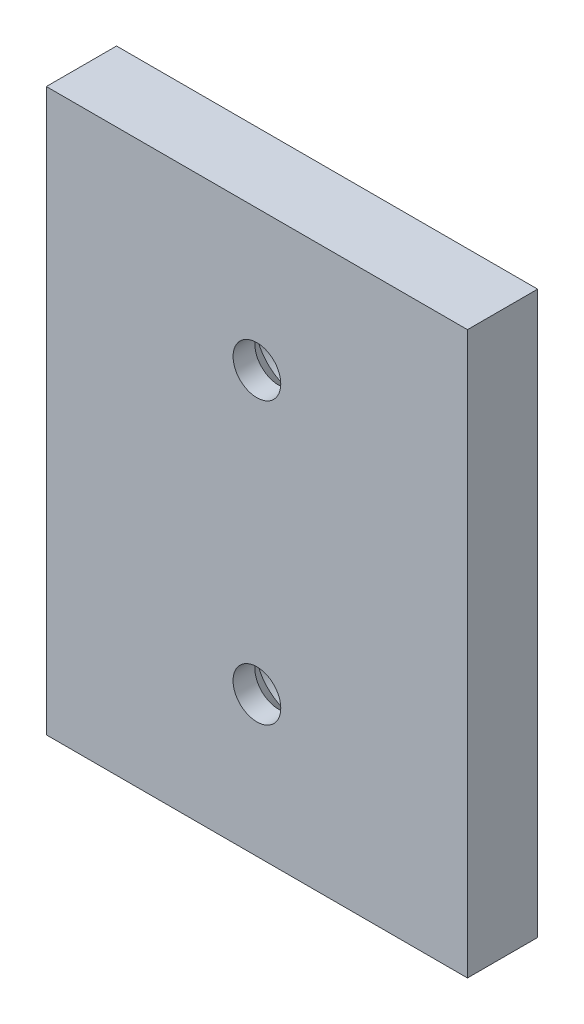
ISO-10303-21;
HEADER;
FILE_DESCRIPTION(('STEP AP214'),'2;1');
FILE_NAME('part.step','',(''),(''),'','','');
FILE_SCHEMA(('AUTOMOTIVE_DESIGN { 1 0 10303 214 1 1 1 1 }'));
ENDSEC;
DATA;
#1=APPLICATION_CONTEXT('core data for automotive mechanical design processes');
#2=APPLICATION_PROTOCOL_DEFINITION('international standard','automotive_design',2000,#1);
#3=PRODUCT_CONTEXT('',#1,'mechanical');
#4=PRODUCT('Part','Part','',(#3));
#5=PRODUCT_RELATED_PRODUCT_CATEGORY('part','',(#4));
#6=PRODUCT_DEFINITION_FORMATION('','',#4);
#7=PRODUCT_DEFINITION_CONTEXT('part definition',#1,'design');
#8=PRODUCT_DEFINITION('design','',#6,#7);
#9=PRODUCT_DEFINITION_SHAPE('','',#8);
#10=(LENGTH_UNIT() NAMED_UNIT(*) SI_UNIT(.MILLI.,.METRE.));
#11=(NAMED_UNIT(*) PLANE_ANGLE_UNIT() SI_UNIT($,.RADIAN.));
#12=(NAMED_UNIT(*) SI_UNIT($,.STERADIAN.) SOLID_ANGLE_UNIT());
#13=UNCERTAINTY_MEASURE_WITH_UNIT(LENGTH_MEASURE(1.E-05),#10,'distance_accuracy_value','');
#14=(GEOMETRIC_REPRESENTATION_CONTEXT(3) GLOBAL_UNCERTAINTY_ASSIGNED_CONTEXT((#13)) GLOBAL_UNIT_ASSIGNED_CONTEXT((#10,
#11,#12)) REPRESENTATION_CONTEXT('',''));
#15=CARTESIAN_POINT('',(0.,0.,0.));
#16=DIRECTION('',(0.,0.,1.));
#17=DIRECTION('',(1.,0.,0.));
#18=AXIS2_PLACEMENT_3D('',#15,#16,#17);
#19=CARTESIAN_POINT('',(15.,10.,0.002300000000105));
#20=DIRECTION('',(0.,0.,1.));
#21=DIRECTION('',(1.,0.,0.));
#22=AXIS2_PLACEMENT_3D('',#19,#20,#21);
#23=CYLINDRICAL_SURFACE('',#22,3.25);
#24=CARTESIAN_POINT('',(15.,10.,0.002299999999991));
#25=DIRECTION('',(0.,0.,1.));
#26=DIRECTION('',(1.,0.,0.));
#27=AXIS2_PLACEMENT_3D('',#24,#25,#26);
#28=CIRCLE('',#27,3.25);
#29=CARTESIAN_POINT('',(18.25,10.,0.002299999999991));
#30=VERTEX_POINT('',#29);
#31=EDGE_CURVE('E94',#30,#30,#28,.F.);
#32=ORIENTED_EDGE('',*,*,#31,.T.);
#33=EDGE_LOOP('',(#32));
#34=FACE_BOUND('',#33,.T.);
#35=CARTESIAN_POINT('',(15.,10.,2.0023));
#36=DIRECTION('',(0.,0.,1.));
#37=DIRECTION('',(1.,0.,0.));
#38=AXIS2_PLACEMENT_3D('',#35,#36,#37);
#39=CIRCLE('',#38,3.25);
#40=CARTESIAN_POINT('',(18.25,10.,2.0023));
#41=VERTEX_POINT('',#40);
#42=EDGE_CURVE('E19',#41,#41,#39,.T.);
#43=ORIENTED_EDGE('',*,*,#42,.T.);
#44=EDGE_LOOP('',(#43));
#45=FACE_BOUND('',#44,.T.);
#46=ADVANCED_FACE('F16',(#34,#45),#23,.F.);
#47=CARTESIAN_POINT('',(15.,30.,0.002300000000105));
#48=DIRECTION('',(0.,0.,1.));
#49=DIRECTION('',(1.,0.,0.));
#50=AXIS2_PLACEMENT_3D('',#47,#48,#49);
#51=CYLINDRICAL_SURFACE('',#50,3.25);
#52=CARTESIAN_POINT('',(15.,30.,0.002299999999991));
#53=DIRECTION('',(0.,0.,1.));
#54=DIRECTION('',(1.,0.,0.));
#55=AXIS2_PLACEMENT_3D('',#52,#53,#54);
#56=CIRCLE('',#55,3.25);
#57=CARTESIAN_POINT('',(18.25,30.,0.002299999999991));
#58=VERTEX_POINT('',#57);
#59=EDGE_CURVE('E91',#58,#58,#56,.F.);
#60=ORIENTED_EDGE('',*,*,#59,.T.);
#61=EDGE_LOOP('',(#60));
#62=FACE_BOUND('',#61,.T.);
#63=CARTESIAN_POINT('',(15.,30.,2.0023));
#64=DIRECTION('',(0.,0.,1.));
#65=DIRECTION('',(1.,0.,0.));
#66=AXIS2_PLACEMENT_3D('',#63,#64,#65);
#67=CIRCLE('',#66,3.25);
#68=CARTESIAN_POINT('',(18.25,30.,2.0023));
#69=VERTEX_POINT('',#68);
#70=EDGE_CURVE('E96',#69,#69,#67,.T.);
#71=ORIENTED_EDGE('',*,*,#70,.T.);
#72=EDGE_LOOP('',(#71));
#73=FACE_BOUND('',#72,.T.);
#74=ADVANCED_FACE('F107',(#62,#73),#51,.F.);
#75=CARTESIAN_POINT('',(15.,10.,2.0023));
#76=DIRECTION('',(0.,0.,1.));
#77=DIRECTION('',(1.,0.,0.));
#78=AXIS2_PLACEMENT_3D('',#75,#76,#77);
#79=PLANE('',#78);
#80=CARTESIAN_POINT('',(15.,10.,2.00229999995827));
#81=DIRECTION('',(0.,0.,-1.));
#82=DIRECTION('',(-1.,0.,0.));
#83=AXIS2_PLACEMENT_3D('',#80,#81,#82);
#84=CIRCLE('',#83,3.15000000004829);
#85=CARTESIAN_POINT('',(11.8499999999517,10.,2.00229999995827));
#86=VERTEX_POINT('',#85);
#87=EDGE_CURVE('E88',#86,#86,#84,.F.);
#88=ORIENTED_EDGE('',*,*,#87,.T.);
#89=EDGE_LOOP('',(#88));
#90=FACE_BOUND('',#89,.T.);
#91=ORIENTED_EDGE('',*,*,#42,.F.);
#92=EDGE_LOOP('',(#91));
#93=FACE_BOUND('',#92,.T.);
#94=ADVANCED_FACE('F104',(#90,#93),#79,.F.);
#95=CARTESIAN_POINT('',(15.,30.,2.0023));
#96=DIRECTION('',(0.,0.,1.));
#97=DIRECTION('',(1.,0.,0.));
#98=AXIS2_PLACEMENT_3D('',#95,#96,#97);
#99=PLANE('',#98);
#100=CARTESIAN_POINT('',(15.,30.,2.00229999995827));
#101=DIRECTION('',(0.,0.,-1.));
#102=DIRECTION('',(-1.,0.,0.));
#103=AXIS2_PLACEMENT_3D('',#100,#101,#102);
#104=CIRCLE('',#103,3.15000000004829);
#105=CARTESIAN_POINT('',(11.8499999999517,30.,2.00229999995827));
#106=VERTEX_POINT('',#105);
#107=EDGE_CURVE('E72',#106,#106,#104,.F.);
#108=ORIENTED_EDGE('',*,*,#107,.T.);
#109=EDGE_LOOP('',(#108));
#110=FACE_BOUND('',#109,.T.);
#111=ORIENTED_EDGE('',*,*,#70,.F.);
#112=EDGE_LOOP('',(#111));
#113=FACE_BOUND('',#112,.T.);
#114=ADVANCED_FACE('F106',(#110,#113),#99,.F.);
#115=CARTESIAN_POINT('',(0.,0.,0.002300000000105));
#116=DIRECTION('',(0.,0.,1.));
#117=DIRECTION('',(1.,0.,0.));
#118=AXIS2_PLACEMENT_3D('',#115,#116,#117);
#119=PLANE('',#118);
#120=ORIENTED_EDGE('',*,*,#59,.F.);
#121=EDGE_LOOP('',(#120));
#122=FACE_BOUND('',#121,.T.);
#123=ORIENTED_EDGE('',*,*,#31,.F.);
#124=EDGE_LOOP('',(#123));
#125=FACE_BOUND('',#124,.T.);
#126=DIRECTION('',(0.,1.,0.));
#127=VECTOR('',#126,1.);
#128=CARTESIAN_POINT('',(30.,0.,0.002299999999991));
#129=LINE('',#128,#127);
#130=CARTESIAN_POINT('',(30.,0.,0.0023000000000195));
#131=VERTEX_POINT('',#130);
#132=CARTESIAN_POINT('',(30.,40.,0.002300000000048));
#133=VERTEX_POINT('',#132);
#134=EDGE_CURVE('E62',#131,#133,#129,.T.);
#135=ORIENTED_EDGE('',*,*,#134,.F.);
#136=DIRECTION('',(1.,0.,0.));
#137=VECTOR('',#136,1.);
#138=CARTESIAN_POINT('',(0.,0.,0.002299999999991));
#139=LINE('',#138,#137);
#140=CARTESIAN_POINT('',(0.,0.,0.002300000000048));
#141=VERTEX_POINT('',#140);
#142=EDGE_CURVE('E55',#131,#141,#139,.F.);
#143=ORIENTED_EDGE('',*,*,#142,.T.);
#144=DIRECTION('',(0.,1.,0.));
#145=VECTOR('',#144,1.);
#146=CARTESIAN_POINT('',(0.,0.,0.002299999999991));
#147=LINE('',#146,#145);
#148=CARTESIAN_POINT('',(0.,40.,0.002300000000048));
#149=VERTEX_POINT('',#148);
#150=EDGE_CURVE('E60',#141,#149,#147,.T.);
#151=ORIENTED_EDGE('',*,*,#150,.T.);
#152=DIRECTION('',(1.,0.,0.));
#153=VECTOR('',#152,1.);
#154=CARTESIAN_POINT('',(0.,40.,0.002299999999991));
#155=LINE('',#154,#153);
#156=EDGE_CURVE('E262',#133,#149,#155,.F.);
#157=ORIENTED_EDGE('',*,*,#156,.F.);
#158=EDGE_LOOP('',(#135,#143,#151,#157));
#159=FACE_BOUND('',#158,.T.);
#160=ADVANCED_FACE('F59',(#122,#125,#159),#119,.F.);
#161=CARTESIAN_POINT('',(15.,10.,2.00229999990142));
#162=DIRECTION('',(0.,0.,-1.));
#163=DIRECTION('',(-1.,0.,0.));
#164=AXIS2_PLACEMENT_3D('',#161,#162,#163);
#165=CONICAL_SURFACE('',#164,3.15000000010514,0.785398163377847);
#166=ORIENTED_EDGE('',*,*,#87,.F.);
#167=EDGE_LOOP('',(#166));
#168=FACE_BOUND('',#167,.T.);
#169=CARTESIAN_POINT('',(15.,10.,3.4523));
#170=DIRECTION('',(0.,0.,1.));
#171=DIRECTION('',(1.,0.,0.));
#172=AXIS2_PLACEMENT_3D('',#169,#170,#171);
#173=CIRCLE('',#172,1.7);
#174=CARTESIAN_POINT('',(16.7,10.,3.4523));
#175=VERTEX_POINT('',#174);
#176=EDGE_CURVE('E251',#175,#175,#173,.T.);
#177=ORIENTED_EDGE('',*,*,#176,.T.);
#178=EDGE_LOOP('',(#177));
#179=FACE_BOUND('',#178,.T.);
#180=ADVANCED_FACE('F148',(#168,#179),#165,.F.);
#181=CARTESIAN_POINT('',(15.,30.,2.00229999990142));
#182=DIRECTION('',(0.,0.,-1.));
#183=DIRECTION('',(-1.,0.,0.));
#184=AXIS2_PLACEMENT_3D('',#181,#182,#183);
#185=CONICAL_SURFACE('',#184,3.15000000010514,0.785398163377847);
#186=ORIENTED_EDGE('',*,*,#107,.F.);
#187=EDGE_LOOP('',(#186));
#188=FACE_BOUND('',#187,.T.);
#189=CARTESIAN_POINT('',(15.,30.,3.4523));
#190=DIRECTION('',(0.,0.,1.));
#191=DIRECTION('',(1.,0.,0.));
#192=AXIS2_PLACEMENT_3D('',#189,#190,#191);
#193=CIRCLE('',#192,1.7);
#194=CARTESIAN_POINT('',(16.7,30.,3.4523));
#195=VERTEX_POINT('',#194);
#196=EDGE_CURVE('E253',#195,#195,#193,.T.);
#197=ORIENTED_EDGE('',*,*,#196,.T.);
#198=EDGE_LOOP('',(#197));
#199=FACE_BOUND('',#198,.T.);
#200=ADVANCED_FACE('F145',(#188,#199),#185,.F.);
#201=CARTESIAN_POINT('',(0.,0.,0.002300000000105));
#202=DIRECTION('',(1.,0.,0.));
#203=DIRECTION('',(0.,0.,-1.));
#204=AXIS2_PLACEMENT_3D('',#201,#202,#203);
#205=PLANE('',#204);
#206=DIRECTION('',(0.,0.,1.));
#207=VECTOR('',#206,1.);
#208=CARTESIAN_POINT('',(0.,40.,0.002300000000105));
#209=LINE('',#208,#207);
#210=CARTESIAN_POINT('',(0.,40.,5.0023));
#211=VERTEX_POINT('',#210);
#212=EDGE_CURVE('E70',#149,#211,#209,.T.);
#213=ORIENTED_EDGE('',*,*,#212,.F.);
#214=ORIENTED_EDGE('',*,*,#150,.F.);
#215=DIRECTION('',(0.,0.,1.));
#216=VECTOR('',#215,1.);
#217=CARTESIAN_POINT('',(0.,0.,0.002300000000105));
#218=LINE('',#217,#216);
#219=CARTESIAN_POINT('',(0.,0.,5.0023));
#220=VERTEX_POINT('',#219);
#221=EDGE_CURVE('E64',#141,#220,#218,.T.);
#222=ORIENTED_EDGE('',*,*,#221,.T.);
#223=DIRECTION('',(0.,1.,0.));
#224=VECTOR('',#223,1.);
#225=CARTESIAN_POINT('',(0.,0.,5.0023));
#226=LINE('',#225,#224);
#227=EDGE_CURVE('E256',#211,#220,#226,.F.);
#228=ORIENTED_EDGE('',*,*,#227,.F.);
#229=EDGE_LOOP('',(#213,#214,#222,#228));
#230=FACE_BOUND('',#229,.T.);
#231=ADVANCED_FACE('F67',(#230),#205,.F.);
#232=CARTESIAN_POINT('',(0.,0.,0.002300000000105));
#233=DIRECTION('',(0.,1.,0.));
#234=DIRECTION('',(0.,0.,1.));
#235=AXIS2_PLACEMENT_3D('',#232,#233,#234);
#236=PLANE('',#235);
#237=DIRECTION('',(1.,0.,0.));
#238=VECTOR('',#237,1.);
#239=CARTESIAN_POINT('',(0.,0.,5.0023));
#240=LINE('',#239,#238);
#241=CARTESIAN_POINT('',(30.,0.,5.0023));
#242=VERTEX_POINT('',#241);
#243=EDGE_CURVE('E76',#220,#242,#240,.T.);
#244=ORIENTED_EDGE('',*,*,#243,.F.);
#245=ORIENTED_EDGE('',*,*,#221,.F.);
#246=ORIENTED_EDGE('',*,*,#142,.F.);
#247=DIRECTION('',(0.,0.,-1.));
#248=VECTOR('',#247,1.);
#249=CARTESIAN_POINT('',(30.,0.,0.002300000000105));
#250=LINE('',#249,#248);
#251=EDGE_CURVE('E78',#242,#131,#250,.T.);
#252=ORIENTED_EDGE('',*,*,#251,.F.);
#253=EDGE_LOOP('',(#244,#245,#246,#252));
#254=FACE_BOUND('',#253,.T.);
#255=ADVANCED_FACE('F74',(#254),#236,.F.);
#256=CARTESIAN_POINT('',(30.,0.,0.002300000000105));
#257=DIRECTION('',(1.,0.,0.));
#258=DIRECTION('',(0.,0.,-1.));
#259=AXIS2_PLACEMENT_3D('',#256,#257,#258);
#260=PLANE('',#259);
#261=DIRECTION('',(0.,0.,1.));
#262=VECTOR('',#261,1.);
#263=CARTESIAN_POINT('',(30.,40.,0.002300000000105));
#264=LINE('',#263,#262);
#265=CARTESIAN_POINT('',(30.,40.,5.0023));
#266=VERTEX_POINT('',#265);
#267=EDGE_CURVE('E34',#266,#133,#264,.F.);
#268=ORIENTED_EDGE('',*,*,#267,.F.);
#269=DIRECTION('',(0.,1.,0.));
#270=VECTOR('',#269,1.);
#271=CARTESIAN_POINT('',(30.,0.,5.0023));
#272=LINE('',#271,#270);
#273=EDGE_CURVE('E266',#242,#266,#272,.T.);
#274=ORIENTED_EDGE('',*,*,#273,.F.);
#275=ORIENTED_EDGE('',*,*,#251,.T.);
#276=ORIENTED_EDGE('',*,*,#134,.T.);
#277=EDGE_LOOP('',(#268,#274,#275,#276));
#278=FACE_BOUND('',#277,.T.);
#279=ADVANCED_FACE('F137',(#278),#260,.T.);
#280=CARTESIAN_POINT('',(0.,40.,0.002300000000105));
#281=DIRECTION('',(0.,1.,0.));
#282=DIRECTION('',(0.,0.,1.));
#283=AXIS2_PLACEMENT_3D('',#280,#281,#282);
#284=PLANE('',#283);
#285=DIRECTION('',(1.,0.,0.));
#286=VECTOR('',#285,1.);
#287=CARTESIAN_POINT('',(0.,40.,5.0023));
#288=LINE('',#287,#286);
#289=EDGE_CURVE('E85',#266,#211,#288,.F.);
#290=ORIENTED_EDGE('',*,*,#289,.F.);
#291=ORIENTED_EDGE('',*,*,#267,.T.);
#292=ORIENTED_EDGE('',*,*,#156,.T.);
#293=ORIENTED_EDGE('',*,*,#212,.T.);
#294=EDGE_LOOP('',(#290,#291,#292,#293));
#295=FACE_BOUND('',#294,.T.);
#296=ADVANCED_FACE('F133',(#295),#284,.T.);
#297=CARTESIAN_POINT('',(15.,10.,0.002300000000105));
#298=DIRECTION('',(0.,0.,1.));
#299=DIRECTION('',(1.,0.,0.));
#300=AXIS2_PLACEMENT_3D('',#297,#298,#299);
#301=CYLINDRICAL_SURFACE('',#300,1.7);
#302=CARTESIAN_POINT('',(15.,10.,5.0023));
#303=DIRECTION('',(0.,0.,1.));
#304=DIRECTION('',(1.,0.,0.));
#305=AXIS2_PLACEMENT_3D('',#302,#303,#304);
#306=CIRCLE('',#305,1.7);
#307=CARTESIAN_POINT('',(16.7,10.,5.0023));
#308=VERTEX_POINT('',#307);
#309=EDGE_CURVE('E25',#308,#308,#306,.F.);
#310=ORIENTED_EDGE('',*,*,#309,.F.);
#311=EDGE_LOOP('',(#310));
#312=FACE_BOUND('',#311,.T.);
#313=ORIENTED_EDGE('',*,*,#176,.F.);
#314=EDGE_LOOP('',(#313));
#315=FACE_BOUND('',#314,.T.);
#316=ADVANCED_FACE('F126',(#312,#315),#301,.F.);
#317=CARTESIAN_POINT('',(15.,30.,0.002300000000105));
#318=DIRECTION('',(0.,0.,1.));
#319=DIRECTION('',(1.,0.,0.));
#320=AXIS2_PLACEMENT_3D('',#317,#318,#319);
#321=CYLINDRICAL_SURFACE('',#320,1.7);
#322=CARTESIAN_POINT('',(15.,30.,5.0023));
#323=DIRECTION('',(0.,0.,1.));
#324=DIRECTION('',(1.,0.,0.));
#325=AXIS2_PLACEMENT_3D('',#322,#323,#324);
#326=CIRCLE('',#325,1.7);
#327=CARTESIAN_POINT('',(16.7,30.,5.0023));
#328=VERTEX_POINT('',#327);
#329=EDGE_CURVE('E11',#328,#328,#326,.F.);
#330=ORIENTED_EDGE('',*,*,#329,.F.);
#331=EDGE_LOOP('',(#330));
#332=FACE_BOUND('',#331,.T.);
#333=ORIENTED_EDGE('',*,*,#196,.F.);
#334=EDGE_LOOP('',(#333));
#335=FACE_BOUND('',#334,.T.);
#336=ADVANCED_FACE('F120',(#332,#335),#321,.F.);
#337=CARTESIAN_POINT('',(0.,0.,5.0023));
#338=DIRECTION('',(0.,0.,1.));
#339=DIRECTION('',(1.,0.,0.));
#340=AXIS2_PLACEMENT_3D('',#337,#338,#339);
#341=PLANE('',#340);
#342=ORIENTED_EDGE('',*,*,#329,.T.);
#343=EDGE_LOOP('',(#342));
#344=FACE_BOUND('',#343,.T.);
#345=ORIENTED_EDGE('',*,*,#309,.T.);
#346=EDGE_LOOP('',(#345));
#347=FACE_BOUND('',#346,.T.);
#348=ORIENTED_EDGE('',*,*,#273,.T.);
#349=ORIENTED_EDGE('',*,*,#289,.T.);
#350=ORIENTED_EDGE('',*,*,#227,.T.);
#351=ORIENTED_EDGE('',*,*,#243,.T.);
#352=EDGE_LOOP('',(#348,#349,#350,#351));
#353=FACE_BOUND('',#352,.T.);
#354=ADVANCED_FACE('F118',(#344,#347,#353),#341,.T.);
#355=CLOSED_SHELL('',(#46,#74,#94,#114,#160,#180,#200,#231,#255,#279,#296,#316,#336,#354));
#356=MANIFOLD_SOLID_BREP('B1',#355);
#357=ADVANCED_BREP_SHAPE_REPRESENTATION('',(#18,#356),#14);
#358=SHAPE_DEFINITION_REPRESENTATION(#9,#357);
ENDSEC;
END-ISO-10303-21;
